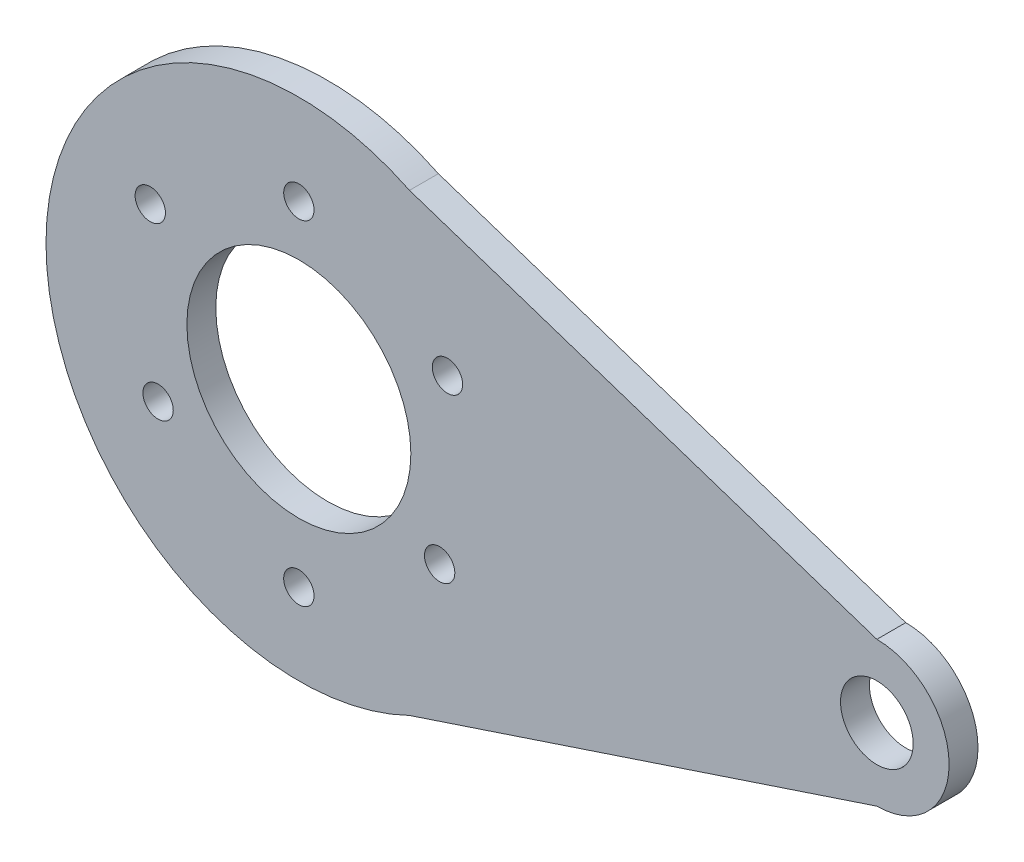
ISO-10303-21;
HEADER;
FILE_DESCRIPTION(('STEP AP214'),'2;1');
FILE_NAME('part.step','',(''),(''),'','','');
FILE_SCHEMA(('AUTOMOTIVE_DESIGN { 1 0 10303 214 1 1 1 1 }'));
ENDSEC;
DATA;
#1=APPLICATION_CONTEXT('core data for automotive mechanical design processes');
#2=APPLICATION_PROTOCOL_DEFINITION('international standard','automotive_design',2000,#1);
#3=PRODUCT_CONTEXT('',#1,'mechanical');
#4=PRODUCT('Part','Part','',(#3));
#5=PRODUCT_RELATED_PRODUCT_CATEGORY('part','',(#4));
#6=PRODUCT_DEFINITION_FORMATION('','',#4);
#7=PRODUCT_DEFINITION_CONTEXT('part definition',#1,'design');
#8=PRODUCT_DEFINITION('design','',#6,#7);
#9=PRODUCT_DEFINITION_SHAPE('','',#8);
#10=(LENGTH_UNIT() NAMED_UNIT(*) SI_UNIT(.MILLI.,.METRE.));
#11=(NAMED_UNIT(*) PLANE_ANGLE_UNIT() SI_UNIT($,.RADIAN.));
#12=(NAMED_UNIT(*) SI_UNIT($,.STERADIAN.) SOLID_ANGLE_UNIT());
#13=UNCERTAINTY_MEASURE_WITH_UNIT(LENGTH_MEASURE(1.E-05),#10,'distance_accuracy_value','');
#14=(GEOMETRIC_REPRESENTATION_CONTEXT(3) GLOBAL_UNCERTAINTY_ASSIGNED_CONTEXT((#13)) GLOBAL_UNIT_ASSIGNED_CONTEXT((#10,
#11,#12)) REPRESENTATION_CONTEXT('',''));
#15=CARTESIAN_POINT('',(0.,0.,0.));
#16=DIRECTION('',(0.,0.,1.));
#17=DIRECTION('',(1.,0.,0.));
#18=AXIS2_PLACEMENT_3D('',#15,#16,#17);
#19=CARTESIAN_POINT('',(82.5740743672686,-5.52758783429424,4.));
#20=DIRECTION('',(0.,0.,-1.));
#21=DIRECTION('',(-1.,0.,0.));
#22=AXIS2_PLACEMENT_3D('',#19,#20,#21);
#23=PLANE('',#22);
#24=CARTESIAN_POINT('',(82.5740743672686,-5.52758783429424,4.));
#25=DIRECTION('',(0.,0.,1.));
#26=DIRECTION('',(-1.,0.,0.));
#27=AXIS2_PLACEMENT_3D('',#24,#25,#26);
#28=CIRCLE('',#27,9.99999999999999);
#29=CARTESIAN_POINT('',(82.5740743672686,-15.5275878342942,4.));
#30=VERTEX_POINT('',#29);
#31=CARTESIAN_POINT('',(82.5740743672686,4.47241216570575,4.));
#32=VERTEX_POINT('',#31);
#33=EDGE_CURVE('E86',#30,#32,#28,.T.);
#34=ORIENTED_EDGE('',*,*,#33,.T.);
#35=DIRECTION('',(-0.949078057551367,0.315041014273577,0.));
#36=VECTOR('',#35,1.);
#37=CARTESIAN_POINT('',(82.5740743672686,4.47241216570575,4.));
#38=LINE('',#37,#36);
#39=CARTESIAN_POINT('',(17.8865743672686,25.9450565374455,4.));
#40=VERTEX_POINT('',#39);
#41=EDGE_CURVE('E81',#32,#40,#38,.T.);
#42=ORIENTED_EDGE('',*,*,#41,.T.);
#43=CARTESIAN_POINT('',(2.57407436726858,-5.52758783429424,4.));
#44=DIRECTION('',(0.,0.,1.));
#45=DIRECTION('',(1.,0.,0.));
#46=AXIS2_PLACEMENT_3D('',#43,#44,#45);
#47=CIRCLE('',#46,35.);
#48=CARTESIAN_POINT('',(17.8865743672686,-37.000232206034,4.));
#49=VERTEX_POINT('',#48);
#50=EDGE_CURVE('E84',#40,#49,#47,.T.);
#51=ORIENTED_EDGE('',*,*,#50,.T.);
#52=DIRECTION('',(0.949078057551367,0.315041014273577,0.));
#53=VECTOR('',#52,1.);
#54=CARTESIAN_POINT('',(17.8865743672686,-37.000232206034,4.));
#55=LINE('',#54,#53);
#56=EDGE_CURVE('E51',#49,#30,#55,.T.);
#57=ORIENTED_EDGE('',*,*,#56,.T.);
#58=EDGE_LOOP('',(#34,#42,#51,#57));
#59=FACE_BOUND('',#58,.T.);
#60=CARTESIAN_POINT('',(2.57407436726858,-29.2775878342943,4.));
#61=DIRECTION('',(0.,0.,1.));
#62=DIRECTION('',(1.,0.,0.));
#63=AXIS2_PLACEMENT_3D('',#60,#61,#62);
#64=CIRCLE('',#63,2.1);
#65=CARTESIAN_POINT('',(4.67407436726858,-29.2775878342943,4.));
#66=VERTEX_POINT('',#65);
#67=EDGE_CURVE('E101',#66,#66,#64,.T.);
#68=ORIENTED_EDGE('',*,*,#67,.F.);
#69=EDGE_LOOP('',(#68));
#70=FACE_BOUND('',#69,.T.);
#71=CARTESIAN_POINT('',(22.0596459524184,-16.7775878342942,4.));
#72=DIRECTION('',(0.,0.,1.));
#73=DIRECTION('',(1.,0.,0.));
#74=AXIS2_PLACEMENT_3D('',#71,#72,#73);
#75=CIRCLE('',#74,2.1);
#76=CARTESIAN_POINT('',(24.1596459524184,-16.7775878342942,4.));
#77=VERTEX_POINT('',#76);
#78=EDGE_CURVE('E116',#77,#77,#75,.T.);
#79=ORIENTED_EDGE('',*,*,#78,.F.);
#80=EDGE_LOOP('',(#79));
#81=FACE_BOUND('',#80,.T.);
#82=CARTESIAN_POINT('',(-17.9940289726118,6.34741216570586,4.));
#83=DIRECTION('',(0.,0.,1.));
#84=DIRECTION('',(1.,0.,0.));
#85=AXIS2_PLACEMENT_3D('',#82,#83,#84);
#86=CIRCLE('',#85,2.1);
#87=CARTESIAN_POINT('',(-15.8940289726118,6.34741216570586,4.));
#88=VERTEX_POINT('',#87);
#89=EDGE_CURVE('E122',#88,#88,#86,.T.);
#90=ORIENTED_EDGE('',*,*,#89,.F.);
#91=EDGE_LOOP('',(#90));
#92=FACE_BOUND('',#91,.T.);
#93=CARTESIAN_POINT('',(23.1421777071491,6.34741216570556,4.));
#94=DIRECTION('',(0.,0.,1.));
#95=DIRECTION('',(1.,0.,0.));
#96=AXIS2_PLACEMENT_3D('',#93,#94,#95);
#97=CIRCLE('',#96,2.1);
#98=CARTESIAN_POINT('',(25.2421777071491,6.34741216570556,4.));
#99=VERTEX_POINT('',#98);
#100=EDGE_CURVE('E128',#99,#99,#97,.T.);
#101=ORIENTED_EDGE('',*,*,#100,.F.);
#102=EDGE_LOOP('',(#101));
#103=FACE_BOUND('',#102,.T.);
#104=CARTESIAN_POINT('',(2.57407436726858,-5.52758783429424,4.));
#105=DIRECTION('',(0.,0.,1.));
#106=DIRECTION('',(1.,0.,0.));
#107=AXIS2_PLACEMENT_3D('',#104,#105,#106);
#108=CIRCLE('',#107,15.5);
#109=CARTESIAN_POINT('',(18.0740743672686,-5.52758783429424,4.));
#110=VERTEX_POINT('',#109);
#111=EDGE_CURVE('E134',#110,#110,#108,.T.);
#112=ORIENTED_EDGE('',*,*,#111,.F.);
#113=EDGE_LOOP('',(#112));
#114=FACE_BOUND('',#113,.T.);
#115=CARTESIAN_POINT('',(82.5740743672686,-5.52758783429424,4.));
#116=DIRECTION('',(0.,0.,1.));
#117=DIRECTION('',(1.,0.,0.));
#118=AXIS2_PLACEMENT_3D('',#115,#116,#117);
#119=CIRCLE('',#118,5.03000000000001);
#120=CARTESIAN_POINT('',(87.6040743672686,-5.52758783429424,4.));
#121=VERTEX_POINT('',#120);
#122=EDGE_CURVE('E140',#121,#121,#119,.T.);
#123=ORIENTED_EDGE('',*,*,#122,.F.);
#124=EDGE_LOOP('',(#123));
#125=FACE_BOUND('',#124,.T.);
#126=CARTESIAN_POINT('',(2.57407436726846,16.9724121657058,4.));
#127=DIRECTION('',(0.,0.,1.));
#128=DIRECTION('',(1.,0.,0.));
#129=AXIS2_PLACEMENT_3D('',#126,#127,#128);
#130=CIRCLE('',#129,2.1);
#131=CARTESIAN_POINT('',(4.67407436726846,16.9724121657058,4.));
#132=VERTEX_POINT('',#131);
#133=EDGE_CURVE('E146',#132,#132,#130,.T.);
#134=ORIENTED_EDGE('',*,*,#133,.F.);
#135=EDGE_LOOP('',(#134));
#136=FACE_BOUND('',#135,.T.);
#137=CARTESIAN_POINT('',(-16.9114972178812,-16.7775878342944,4.));
#138=DIRECTION('',(0.,0.,1.));
#139=DIRECTION('',(1.,0.,0.));
#140=AXIS2_PLACEMENT_3D('',#137,#138,#139);
#141=CIRCLE('',#140,2.1);
#142=CARTESIAN_POINT('',(-14.8114972178812,-16.7775878342944,4.));
#143=VERTEX_POINT('',#142);
#144=EDGE_CURVE('E152',#143,#143,#141,.T.);
#145=ORIENTED_EDGE('',*,*,#144,.F.);
#146=EDGE_LOOP('',(#145));
#147=FACE_BOUND('',#146,.T.);
#148=ADVANCED_FACE('F34',(#59,#70,#81,#92,#103,#114,#125,#136,#147),#23,.F.);
#149=CARTESIAN_POINT('',(82.5740743672686,-5.52758783429424,0.));
#150=DIRECTION('',(0.,0.,-1.));
#151=DIRECTION('',(-1.,0.,0.));
#152=AXIS2_PLACEMENT_3D('',#149,#150,#151);
#153=PLANE('',#152);
#154=CARTESIAN_POINT('',(2.57407436726846,16.9724121657058,0.));
#155=DIRECTION('',(0.,0.,1.));
#156=DIRECTION('',(1.,0.,0.));
#157=AXIS2_PLACEMENT_3D('',#154,#155,#156);
#158=CIRCLE('',#157,2.1);
#159=CARTESIAN_POINT('',(4.67407436726846,16.9724121657058,0.));
#160=VERTEX_POINT('',#159);
#161=EDGE_CURVE('E149',#160,#160,#158,.T.);
#162=ORIENTED_EDGE('',*,*,#161,.T.);
#163=EDGE_LOOP('',(#162));
#164=FACE_BOUND('',#163,.T.);
#165=CARTESIAN_POINT('',(2.57407436726858,-5.52758783429424,0.));
#166=DIRECTION('',(0.,0.,1.));
#167=DIRECTION('',(1.,0.,0.));
#168=AXIS2_PLACEMENT_3D('',#165,#166,#167);
#169=CIRCLE('',#168,15.5);
#170=CARTESIAN_POINT('',(18.0740743672686,-5.52758783429424,0.));
#171=VERTEX_POINT('',#170);
#172=EDGE_CURVE('E137',#171,#171,#169,.T.);
#173=ORIENTED_EDGE('',*,*,#172,.T.);
#174=EDGE_LOOP('',(#173));
#175=FACE_BOUND('',#174,.T.);
#176=CARTESIAN_POINT('',(-17.9940289726118,6.34741216570586,0.));
#177=DIRECTION('',(0.,0.,1.));
#178=DIRECTION('',(1.,0.,0.));
#179=AXIS2_PLACEMENT_3D('',#176,#177,#178);
#180=CIRCLE('',#179,2.1);
#181=CARTESIAN_POINT('',(-15.8940289726118,6.34741216570586,0.));
#182=VERTEX_POINT('',#181);
#183=EDGE_CURVE('E125',#182,#182,#180,.T.);
#184=ORIENTED_EDGE('',*,*,#183,.T.);
#185=EDGE_LOOP('',(#184));
#186=FACE_BOUND('',#185,.T.);
#187=CARTESIAN_POINT('',(2.57407436726858,-29.2775878342943,0.));
#188=DIRECTION('',(0.,0.,1.));
#189=DIRECTION('',(1.,0.,0.));
#190=AXIS2_PLACEMENT_3D('',#187,#188,#189);
#191=CIRCLE('',#190,2.1);
#192=CARTESIAN_POINT('',(4.67407436726858,-29.2775878342943,0.));
#193=VERTEX_POINT('',#192);
#194=EDGE_CURVE('E113',#193,#193,#191,.T.);
#195=ORIENTED_EDGE('',*,*,#194,.T.);
#196=EDGE_LOOP('',(#195));
#197=FACE_BOUND('',#196,.T.);
#198=CARTESIAN_POINT('',(82.5740743672686,-5.52758783429424,0.));
#199=DIRECTION('',(0.,0.,1.));
#200=DIRECTION('',(-1.,0.,0.));
#201=AXIS2_PLACEMENT_3D('',#198,#199,#200);
#202=CIRCLE('',#201,9.99999999999999);
#203=CARTESIAN_POINT('',(82.5740743672686,-15.5275878342942,0.));
#204=VERTEX_POINT('',#203);
#205=CARTESIAN_POINT('',(82.5740743672686,4.47241216570575,0.));
#206=VERTEX_POINT('',#205);
#207=EDGE_CURVE('E98',#204,#206,#202,.T.);
#208=ORIENTED_EDGE('',*,*,#207,.F.);
#209=DIRECTION('',(0.949078057551367,0.315041014273577,0.));
#210=VECTOR('',#209,1.);
#211=CARTESIAN_POINT('',(17.8865743672686,-37.000232206034,0.));
#212=LINE('',#211,#210);
#213=CARTESIAN_POINT('',(17.8865743672686,-37.000232206034,0.));
#214=VERTEX_POINT('',#213);
#215=EDGE_CURVE('E74',#214,#204,#212,.T.);
#216=ORIENTED_EDGE('',*,*,#215,.F.);
#217=CARTESIAN_POINT('',(2.57407436726858,-5.52758783429424,0.));
#218=DIRECTION('',(0.,0.,1.));
#219=DIRECTION('',(1.,0.,0.));
#220=AXIS2_PLACEMENT_3D('',#217,#218,#219);
#221=CIRCLE('',#220,35.);
#222=CARTESIAN_POINT('',(17.8865743672686,25.9450565374455,0.));
#223=VERTEX_POINT('',#222);
#224=EDGE_CURVE('E68',#223,#214,#221,.T.);
#225=ORIENTED_EDGE('',*,*,#224,.F.);
#226=DIRECTION('',(-0.949078057551367,0.315041014273577,0.));
#227=VECTOR('',#226,1.);
#228=CARTESIAN_POINT('',(82.5740743672686,4.47241216570575,0.));
#229=LINE('',#228,#227);
#230=EDGE_CURVE('E90',#206,#223,#229,.T.);
#231=ORIENTED_EDGE('',*,*,#230,.F.);
#232=EDGE_LOOP('',(#208,#216,#225,#231));
#233=FACE_BOUND('',#232,.T.);
#234=CARTESIAN_POINT('',(22.0596459524184,-16.7775878342942,0.));
#235=DIRECTION('',(0.,0.,1.));
#236=DIRECTION('',(1.,0.,0.));
#237=AXIS2_PLACEMENT_3D('',#234,#235,#236);
#238=CIRCLE('',#237,2.1);
#239=CARTESIAN_POINT('',(24.1596459524184,-16.7775878342942,0.));
#240=VERTEX_POINT('',#239);
#241=EDGE_CURVE('E119',#240,#240,#238,.T.);
#242=ORIENTED_EDGE('',*,*,#241,.T.);
#243=EDGE_LOOP('',(#242));
#244=FACE_BOUND('',#243,.T.);
#245=CARTESIAN_POINT('',(23.1421777071491,6.34741216570556,0.));
#246=DIRECTION('',(0.,0.,1.));
#247=DIRECTION('',(1.,0.,0.));
#248=AXIS2_PLACEMENT_3D('',#245,#246,#247);
#249=CIRCLE('',#248,2.1);
#250=CARTESIAN_POINT('',(25.2421777071491,6.34741216570556,0.));
#251=VERTEX_POINT('',#250);
#252=EDGE_CURVE('E131',#251,#251,#249,.T.);
#253=ORIENTED_EDGE('',*,*,#252,.T.);
#254=EDGE_LOOP('',(#253));
#255=FACE_BOUND('',#254,.T.);
#256=CARTESIAN_POINT('',(82.5740743672686,-5.52758783429424,0.));
#257=DIRECTION('',(0.,0.,1.));
#258=DIRECTION('',(1.,0.,0.));
#259=AXIS2_PLACEMENT_3D('',#256,#257,#258);
#260=CIRCLE('',#259,5.03000000000001);
#261=CARTESIAN_POINT('',(87.6040743672686,-5.52758783429424,0.));
#262=VERTEX_POINT('',#261);
#263=EDGE_CURVE('E143',#262,#262,#260,.T.);
#264=ORIENTED_EDGE('',*,*,#263,.T.);
#265=EDGE_LOOP('',(#264));
#266=FACE_BOUND('',#265,.T.);
#267=CARTESIAN_POINT('',(-16.9114972178812,-16.7775878342944,0.));
#268=DIRECTION('',(0.,0.,1.));
#269=DIRECTION('',(1.,0.,0.));
#270=AXIS2_PLACEMENT_3D('',#267,#268,#269);
#271=CIRCLE('',#270,2.1);
#272=CARTESIAN_POINT('',(-14.8114972178812,-16.7775878342944,0.));
#273=VERTEX_POINT('',#272);
#274=EDGE_CURVE('E155',#273,#273,#271,.T.);
#275=ORIENTED_EDGE('',*,*,#274,.T.);
#276=EDGE_LOOP('',(#275));
#277=FACE_BOUND('',#276,.T.);
#278=ADVANCED_FACE('F109',(#164,#175,#186,#197,#233,#244,#255,#266,#277),#153,.T.);
#279=CARTESIAN_POINT('',(82.5740743672686,-5.52758783429424,4.));
#280=DIRECTION('',(0.,0.,-1.));
#281=DIRECTION('',(-1.,0.,0.));
#282=AXIS2_PLACEMENT_3D('',#279,#280,#281);
#283=CYLINDRICAL_SURFACE('',#282,9.99999999999999);
#284=ORIENTED_EDGE('',*,*,#207,.T.);
#285=DIRECTION('',(0.,0.,-1.));
#286=VECTOR('',#285,1.);
#287=CARTESIAN_POINT('',(82.5740743672686,4.47241216570575,4.));
#288=LINE('',#287,#286);
#289=EDGE_CURVE('E11',#32,#206,#288,.T.);
#290=ORIENTED_EDGE('',*,*,#289,.F.);
#291=ORIENTED_EDGE('',*,*,#33,.F.);
#292=DIRECTION('',(0.,0.,-1.));
#293=VECTOR('',#292,1.);
#294=CARTESIAN_POINT('',(82.5740743672686,-15.5275878342942,4.));
#295=LINE('',#294,#293);
#296=EDGE_CURVE('E94',#30,#204,#295,.T.);
#297=ORIENTED_EDGE('',*,*,#296,.T.);
#298=EDGE_LOOP('',(#284,#290,#291,#297));
#299=FACE_BOUND('',#298,.T.);
#300=ADVANCED_FACE('F36',(#299),#283,.T.);
#301=CARTESIAN_POINT('',(82.5740743672686,4.47241216570575,4.));
#302=DIRECTION('',(-0.315041014273577,-0.949078057551367,0.));
#303=DIRECTION('',(0.949078057551367,-0.315041014273577,0.));
#304=AXIS2_PLACEMENT_3D('',#301,#302,#303);
#305=PLANE('',#304);
#306=ORIENTED_EDGE('',*,*,#230,.T.);
#307=DIRECTION('',(0.,0.,-1.));
#308=VECTOR('',#307,1.);
#309=CARTESIAN_POINT('',(17.8865743672686,25.9450565374455,4.));
#310=LINE('',#309,#308);
#311=EDGE_CURVE('E43',#40,#223,#310,.T.);
#312=ORIENTED_EDGE('',*,*,#311,.F.);
#313=ORIENTED_EDGE('',*,*,#41,.F.);
#314=ORIENTED_EDGE('',*,*,#289,.T.);
#315=EDGE_LOOP('',(#306,#312,#313,#314));
#316=FACE_BOUND('',#315,.T.);
#317=ADVANCED_FACE('F89',(#316),#305,.F.);
#318=CARTESIAN_POINT('',(2.57407436726858,-5.52758783429424,4.));
#319=DIRECTION('',(0.,0.,-1.));
#320=DIRECTION('',(-1.,0.,0.));
#321=AXIS2_PLACEMENT_3D('',#318,#319,#320);
#322=CYLINDRICAL_SURFACE('',#321,35.);
#323=ORIENTED_EDGE('',*,*,#224,.T.);
#324=DIRECTION('',(0.,0.,-1.));
#325=VECTOR('',#324,1.);
#326=CARTESIAN_POINT('',(17.8865743672686,-37.000232206034,4.));
#327=LINE('',#326,#325);
#328=EDGE_CURVE('E91',#49,#214,#327,.T.);
#329=ORIENTED_EDGE('',*,*,#328,.F.);
#330=ORIENTED_EDGE('',*,*,#50,.F.);
#331=ORIENTED_EDGE('',*,*,#311,.T.);
#332=EDGE_LOOP('',(#323,#329,#330,#331));
#333=FACE_BOUND('',#332,.T.);
#334=ADVANCED_FACE('F92',(#333),#322,.T.);
#335=CARTESIAN_POINT('',(17.8865743672686,-37.000232206034,4.));
#336=DIRECTION('',(-0.315041014273577,0.949078057551367,0.));
#337=DIRECTION('',(-0.949078057551367,-0.315041014273577,0.));
#338=AXIS2_PLACEMENT_3D('',#335,#336,#337);
#339=PLANE('',#338);
#340=ORIENTED_EDGE('',*,*,#215,.T.);
#341=ORIENTED_EDGE('',*,*,#296,.F.);
#342=ORIENTED_EDGE('',*,*,#56,.F.);
#343=ORIENTED_EDGE('',*,*,#328,.T.);
#344=EDGE_LOOP('',(#340,#341,#342,#343));
#345=FACE_BOUND('',#344,.T.);
#346=ADVANCED_FACE('F106',(#345),#339,.F.);
#347=CARTESIAN_POINT('',(2.57407436726858,-29.2775878342943,4.));
#348=DIRECTION('',(0.,0.,-1.));
#349=DIRECTION('',(-1.,0.,0.));
#350=AXIS2_PLACEMENT_3D('',#347,#348,#349);
#351=CYLINDRICAL_SURFACE('',#350,2.1);
#352=ORIENTED_EDGE('',*,*,#67,.T.);
#353=EDGE_LOOP('',(#352));
#354=FACE_BOUND('',#353,.T.);
#355=ORIENTED_EDGE('',*,*,#194,.F.);
#356=EDGE_LOOP('',(#355));
#357=FACE_BOUND('',#356,.T.);
#358=ADVANCED_FACE('F172',(#354,#357),#351,.F.);
#359=CARTESIAN_POINT('',(22.0596459524184,-16.7775878342942,4.));
#360=DIRECTION('',(0.,0.,-1.));
#361=DIRECTION('',(-1.,0.,0.));
#362=AXIS2_PLACEMENT_3D('',#359,#360,#361);
#363=CYLINDRICAL_SURFACE('',#362,2.1);
#364=ORIENTED_EDGE('',*,*,#78,.T.);
#365=EDGE_LOOP('',(#364));
#366=FACE_BOUND('',#365,.T.);
#367=ORIENTED_EDGE('',*,*,#241,.F.);
#368=EDGE_LOOP('',(#367));
#369=FACE_BOUND('',#368,.T.);
#370=ADVANCED_FACE('F218',(#366,#369),#363,.F.);
#371=CARTESIAN_POINT('',(-17.9940289726118,6.34741216570586,4.));
#372=DIRECTION('',(0.,0.,-1.));
#373=DIRECTION('',(-1.,0.,0.));
#374=AXIS2_PLACEMENT_3D('',#371,#372,#373);
#375=CYLINDRICAL_SURFACE('',#374,2.1);
#376=ORIENTED_EDGE('',*,*,#89,.T.);
#377=EDGE_LOOP('',(#376));
#378=FACE_BOUND('',#377,.T.);
#379=ORIENTED_EDGE('',*,*,#183,.F.);
#380=EDGE_LOOP('',(#379));
#381=FACE_BOUND('',#380,.T.);
#382=ADVANCED_FACE('F226',(#378,#381),#375,.F.);
#383=CARTESIAN_POINT('',(23.1421777071491,6.34741216570556,4.));
#384=DIRECTION('',(0.,0.,-1.));
#385=DIRECTION('',(-1.,0.,0.));
#386=AXIS2_PLACEMENT_3D('',#383,#384,#385);
#387=CYLINDRICAL_SURFACE('',#386,2.1);
#388=ORIENTED_EDGE('',*,*,#100,.T.);
#389=EDGE_LOOP('',(#388));
#390=FACE_BOUND('',#389,.T.);
#391=ORIENTED_EDGE('',*,*,#252,.F.);
#392=EDGE_LOOP('',(#391));
#393=FACE_BOUND('',#392,.T.);
#394=ADVANCED_FACE('F234',(#390,#393),#387,.F.);
#395=CARTESIAN_POINT('',(2.57407436726858,-5.52758783429424,4.));
#396=DIRECTION('',(0.,0.,-1.));
#397=DIRECTION('',(-1.,0.,0.));
#398=AXIS2_PLACEMENT_3D('',#395,#396,#397);
#399=CYLINDRICAL_SURFACE('',#398,15.5);
#400=ORIENTED_EDGE('',*,*,#111,.T.);
#401=EDGE_LOOP('',(#400));
#402=FACE_BOUND('',#401,.T.);
#403=ORIENTED_EDGE('',*,*,#172,.F.);
#404=EDGE_LOOP('',(#403));
#405=FACE_BOUND('',#404,.T.);
#406=ADVANCED_FACE('F243',(#402,#405),#399,.F.);
#407=CARTESIAN_POINT('',(82.5740743672686,-5.52758783429424,4.));
#408=DIRECTION('',(0.,0.,-1.));
#409=DIRECTION('',(-1.,0.,0.));
#410=AXIS2_PLACEMENT_3D('',#407,#408,#409);
#411=CYLINDRICAL_SURFACE('',#410,5.03000000000001);
#412=ORIENTED_EDGE('',*,*,#122,.T.);
#413=EDGE_LOOP('',(#412));
#414=FACE_BOUND('',#413,.T.);
#415=ORIENTED_EDGE('',*,*,#263,.F.);
#416=EDGE_LOOP('',(#415));
#417=FACE_BOUND('',#416,.T.);
#418=ADVANCED_FACE('F252',(#414,#417),#411,.F.);
#419=CARTESIAN_POINT('',(2.57407436726846,16.9724121657058,4.));
#420=DIRECTION('',(0.,0.,-1.));
#421=DIRECTION('',(-1.,0.,0.));
#422=AXIS2_PLACEMENT_3D('',#419,#420,#421);
#423=CYLINDRICAL_SURFACE('',#422,2.1);
#424=ORIENTED_EDGE('',*,*,#133,.T.);
#425=EDGE_LOOP('',(#424));
#426=FACE_BOUND('',#425,.T.);
#427=ORIENTED_EDGE('',*,*,#161,.F.);
#428=EDGE_LOOP('',(#427));
#429=FACE_BOUND('',#428,.T.);
#430=ADVANCED_FACE('F261',(#426,#429),#423,.F.);
#431=CARTESIAN_POINT('',(-16.9114972178812,-16.7775878342944,4.));
#432=DIRECTION('',(0.,0.,-1.));
#433=DIRECTION('',(-1.,0.,0.));
#434=AXIS2_PLACEMENT_3D('',#431,#432,#433);
#435=CYLINDRICAL_SURFACE('',#434,2.1);
#436=ORIENTED_EDGE('',*,*,#144,.T.);
#437=EDGE_LOOP('',(#436));
#438=FACE_BOUND('',#437,.T.);
#439=ORIENTED_EDGE('',*,*,#274,.F.);
#440=EDGE_LOOP('',(#439));
#441=FACE_BOUND('',#440,.T.);
#442=ADVANCED_FACE('F161',(#438,#441),#435,.F.);
#443=CLOSED_SHELL('',(#148,#278,#300,#317,#334,#346,#358,#370,#382,#394,#406,#418,#430,#442));
#444=MANIFOLD_SOLID_BREP('B2',#443);
#445=ADVANCED_BREP_SHAPE_REPRESENTATION('',(#18,#444),#14);
#446=SHAPE_DEFINITION_REPRESENTATION(#9,#445);
ENDSEC;
END-ISO-10303-21;
